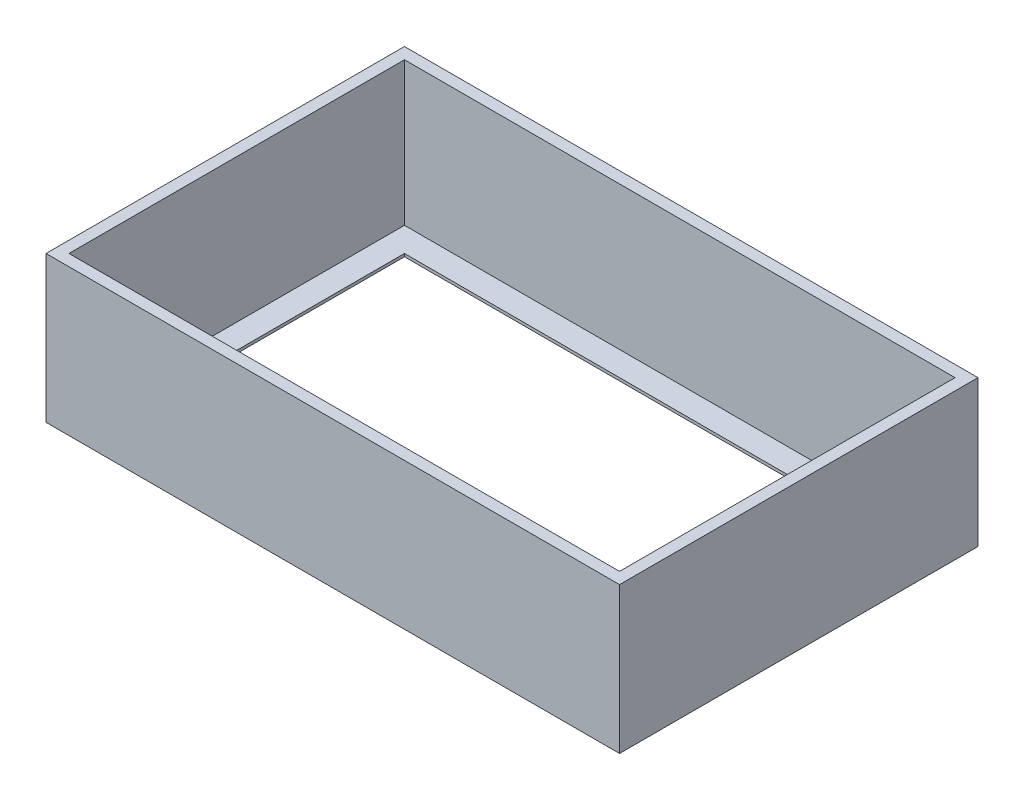
ISO-10303-21;
HEADER;
FILE_DESCRIPTION(('STEP AP214'),'2;1');
FILE_NAME('part.step','',(''),(''),'','','');
FILE_SCHEMA(('AUTOMOTIVE_DESIGN { 1 0 10303 214 1 1 1 1 }'));
ENDSEC;
DATA;
#1=APPLICATION_CONTEXT('core data for automotive mechanical design processes');
#2=APPLICATION_PROTOCOL_DEFINITION('international standard','automotive_design',2000,#1);
#3=PRODUCT_CONTEXT('',#1,'mechanical');
#4=PRODUCT('Part','Part','',(#3));
#5=PRODUCT_RELATED_PRODUCT_CATEGORY('part','',(#4));
#6=PRODUCT_DEFINITION_FORMATION('','',#4);
#7=PRODUCT_DEFINITION_CONTEXT('part definition',#1,'design');
#8=PRODUCT_DEFINITION('design','',#6,#7);
#9=PRODUCT_DEFINITION_SHAPE('','',#8);
#10=(LENGTH_UNIT() NAMED_UNIT(*) SI_UNIT(.MILLI.,.METRE.));
#11=(NAMED_UNIT(*) PLANE_ANGLE_UNIT() SI_UNIT($,.RADIAN.));
#12=(NAMED_UNIT(*) SI_UNIT($,.STERADIAN.) SOLID_ANGLE_UNIT());
#13=UNCERTAINTY_MEASURE_WITH_UNIT(LENGTH_MEASURE(1.E-05),#10,'distance_accuracy_value','');
#14=(GEOMETRIC_REPRESENTATION_CONTEXT(3) GLOBAL_UNCERTAINTY_ASSIGNED_CONTEXT((#13)) GLOBAL_UNIT_ASSIGNED_CONTEXT((#10,
#11,#12)) REPRESENTATION_CONTEXT('',''));
#15=CARTESIAN_POINT('',(0.,0.,0.));
#16=DIRECTION('',(0.,0.,1.));
#17=DIRECTION('',(1.,0.,0.));
#18=AXIS2_PLACEMENT_3D('',#15,#16,#17);
#19=CARTESIAN_POINT('',(0.973770477967721,0.4,0.77550022203393));
#20=DIRECTION('',(1.,0.,0.));
#21=DIRECTION('',(0.,0.,-1.));
#22=AXIS2_PLACEMENT_3D('',#19,#20,#21);
#23=PLANE('',#22);
#24=DIRECTION('',(0.,0.,1.));
#25=VECTOR('',#24,1.);
#26=CARTESIAN_POINT('',(0.973770477967721,0.,0.77550022203393));
#27=LINE('',#26,#25);
#28=CARTESIAN_POINT('',(0.973770477967721,0.,0.77550022203393));
#29=VERTEX_POINT('',#28);
#30=CARTESIAN_POINT('',(0.973770477967721,0.,50.7755002220339));
#31=VERTEX_POINT('',#30);
#32=EDGE_CURVE('E189',#29,#31,#27,.T.);
#33=ORIENTED_EDGE('',*,*,#32,.T.);
#34=DIRECTION('',(0.,-1.,0.));
#35=VECTOR('',#34,1.);
#36=CARTESIAN_POINT('',(0.973770477967721,0.4,50.7755002220339));
#37=LINE('',#36,#35);
#38=CARTESIAN_POINT('',(0.973770477967721,20.4,50.7755002220339));
#39=VERTEX_POINT('',#38);
#40=EDGE_CURVE('E207',#39,#31,#37,.T.);
#41=ORIENTED_EDGE('',*,*,#40,.F.);
#42=DIRECTION('',(0.,0.,1.));
#43=VECTOR('',#42,1.);
#44=CARTESIAN_POINT('',(0.973770477967721,20.4,0.77550022203393));
#45=LINE('',#44,#43);
#46=CARTESIAN_POINT('',(0.973770477967721,20.4,0.77550022203393));
#47=VERTEX_POINT('',#46);
#48=EDGE_CURVE('E177',#47,#39,#45,.T.);
#49=ORIENTED_EDGE('',*,*,#48,.F.);
#50=DIRECTION('',(0.,-1.,0.));
#51=VECTOR('',#50,1.);
#52=CARTESIAN_POINT('',(0.973770477967721,0.4,0.77550022203393));
#53=LINE('',#52,#51);
#54=EDGE_CURVE('E198',#47,#29,#53,.T.);
#55=ORIENTED_EDGE('',*,*,#54,.T.);
#56=EDGE_LOOP('',(#33,#41,#49,#55));
#57=FACE_BOUND('',#56,.T.);
#58=ADVANCED_FACE('F33',(#57),#23,.F.);
#59=CARTESIAN_POINT('',(0.973770477967721,0.4,50.7755002220339));
#60=DIRECTION('',(0.,0.,-1.));
#61=DIRECTION('',(-1.,0.,0.));
#62=AXIS2_PLACEMENT_3D('',#59,#60,#61);
#63=PLANE('',#62);
#64=DIRECTION('',(1.,0.,0.));
#65=VECTOR('',#64,1.);
#66=CARTESIAN_POINT('',(0.973770477967721,0.,50.7755002220339));
#67=LINE('',#66,#65);
#68=CARTESIAN_POINT('',(80.9737704779677,0.,50.7755002220339));
#69=VERTEX_POINT('',#68);
#70=EDGE_CURVE('E192',#31,#69,#67,.T.);
#71=ORIENTED_EDGE('',*,*,#70,.T.);
#72=DIRECTION('',(0.,-1.,0.));
#73=VECTOR('',#72,1.);
#74=CARTESIAN_POINT('',(80.9737704779677,0.4,50.7755002220339));
#75=LINE('',#74,#73);
#76=CARTESIAN_POINT('',(80.9737704779677,20.4,50.7755002220339));
#77=VERTEX_POINT('',#76);
#78=EDGE_CURVE('E204',#77,#69,#75,.T.);
#79=ORIENTED_EDGE('',*,*,#78,.F.);
#80=DIRECTION('',(1.,0.,0.));
#81=VECTOR('',#80,1.);
#82=CARTESIAN_POINT('',(0.973770477967721,20.4,50.7755002220339));
#83=LINE('',#82,#81);
#84=EDGE_CURVE('E180',#39,#77,#83,.T.);
#85=ORIENTED_EDGE('',*,*,#84,.F.);
#86=ORIENTED_EDGE('',*,*,#40,.T.);
#87=EDGE_LOOP('',(#71,#79,#85,#86));
#88=FACE_BOUND('',#87,.T.);
#89=ADVANCED_FACE('F233',(#88),#63,.F.);
#90=CARTESIAN_POINT('',(80.9737704779677,0.4,0.775500222033924));
#91=DIRECTION('',(-1.,0.,0.));
#92=DIRECTION('',(0.,0.,1.));
#93=AXIS2_PLACEMENT_3D('',#90,#91,#92);
#94=PLANE('',#93);
#95=DIRECTION('',(0.,0.,-1.));
#96=VECTOR('',#95,1.);
#97=CARTESIAN_POINT('',(80.9737704779677,0.,0.775500222033924));
#98=LINE('',#97,#96);
#99=CARTESIAN_POINT('',(80.9737704779677,0.,0.775500222033924));
#100=VERTEX_POINT('',#99);
#101=EDGE_CURVE('E194',#69,#100,#98,.T.);
#102=ORIENTED_EDGE('',*,*,#101,.T.);
#103=DIRECTION('',(0.,-1.,0.));
#104=VECTOR('',#103,1.);
#105=CARTESIAN_POINT('',(80.9737704779677,0.4,0.775500222033924));
#106=LINE('',#105,#104);
#107=CARTESIAN_POINT('',(80.9737704779677,20.4,0.77550022203393));
#108=VERTEX_POINT('',#107);
#109=EDGE_CURVE('E201',#108,#100,#106,.T.);
#110=ORIENTED_EDGE('',*,*,#109,.F.);
#111=DIRECTION('',(0.,0.,-1.));
#112=VECTOR('',#111,1.);
#113=CARTESIAN_POINT('',(80.9737704779677,20.4,0.77550022203393));
#114=LINE('',#113,#112);
#115=EDGE_CURVE('E183',#77,#108,#114,.T.);
#116=ORIENTED_EDGE('',*,*,#115,.F.);
#117=ORIENTED_EDGE('',*,*,#78,.T.);
#118=EDGE_LOOP('',(#102,#110,#116,#117));
#119=FACE_BOUND('',#118,.T.);
#120=ADVANCED_FACE('F238',(#119),#94,.F.);
#121=CARTESIAN_POINT('',(0.973770477967721,0.4,0.77550022203393));
#122=DIRECTION('',(0.,0.,1.));
#123=DIRECTION('',(1.,0.,0.));
#124=AXIS2_PLACEMENT_3D('',#121,#122,#123);
#125=PLANE('',#124);
#126=DIRECTION('',(-1.,0.,0.));
#127=VECTOR('',#126,1.);
#128=CARTESIAN_POINT('',(0.973770477967721,0.,0.77550022203393));
#129=LINE('',#128,#127);
#130=EDGE_CURVE('E196',#100,#29,#129,.T.);
#131=ORIENTED_EDGE('',*,*,#130,.T.);
#132=ORIENTED_EDGE('',*,*,#54,.F.);
#133=DIRECTION('',(-1.,0.,0.));
#134=VECTOR('',#133,1.);
#135=CARTESIAN_POINT('',(0.973770477967721,20.4,0.77550022203393));
#136=LINE('',#135,#134);
#137=EDGE_CURVE('E186',#108,#47,#136,.T.);
#138=ORIENTED_EDGE('',*,*,#137,.F.);
#139=ORIENTED_EDGE('',*,*,#109,.T.);
#140=EDGE_LOOP('',(#131,#132,#138,#139));
#141=FACE_BOUND('',#140,.T.);
#142=ADVANCED_FACE('F251',(#141),#125,.F.);
#143=CARTESIAN_POINT('',(0.,0.,0.));
#144=DIRECTION('',(0.,1.,0.));
#145=DIRECTION('',(0.,0.,1.));
#146=AXIS2_PLACEMENT_3D('',#143,#144,#145);
#147=PLANE('',#146);
#148=DIRECTION('',(0.,0.,1.));
#149=VECTOR('',#148,1.);
#150=CARTESIAN_POINT('',(75.9737704779677,0.,5.77550022203393));
#151=LINE('',#150,#149);
#152=CARTESIAN_POINT('',(75.9737704779677,0.,5.77550022203393));
#153=VERTEX_POINT('',#152);
#154=CARTESIAN_POINT('',(75.9737704779677,0.,45.7755002220339));
#155=VERTEX_POINT('',#154);
#156=EDGE_CURVE('E132',#153,#155,#151,.T.);
#157=ORIENTED_EDGE('',*,*,#156,.F.);
#158=DIRECTION('',(1.,0.,0.));
#159=VECTOR('',#158,1.);
#160=CARTESIAN_POINT('',(5.97377047796772,0.,5.77550022203392));
#161=LINE('',#160,#159);
#162=CARTESIAN_POINT('',(5.97377047796772,0.,5.77550022203392));
#163=VERTEX_POINT('',#162);
#164=EDGE_CURVE('E47',#163,#153,#161,.T.);
#165=ORIENTED_EDGE('',*,*,#164,.F.);
#166=DIRECTION('',(0.,0.,-1.));
#167=VECTOR('',#166,1.);
#168=CARTESIAN_POINT('',(5.97377047796772,0.,5.77550022203392));
#169=LINE('',#168,#167);
#170=CARTESIAN_POINT('',(5.97377047796772,0.,45.7755002220339));
#171=VERTEX_POINT('',#170);
#172=EDGE_CURVE('E139',#171,#163,#169,.T.);
#173=ORIENTED_EDGE('',*,*,#172,.F.);
#174=DIRECTION('',(-1.,0.,0.));
#175=VECTOR('',#174,1.);
#176=CARTESIAN_POINT('',(5.97377047796772,0.,45.7755002220339));
#177=LINE('',#176,#175);
#178=EDGE_CURVE('E123',#155,#171,#177,.T.);
#179=ORIENTED_EDGE('',*,*,#178,.F.);
#180=EDGE_LOOP('',(#157,#165,#173,#179));
#181=FACE_BOUND('',#180,.T.);
#182=ORIENTED_EDGE('',*,*,#32,.F.);
#183=ORIENTED_EDGE('',*,*,#130,.F.);
#184=ORIENTED_EDGE('',*,*,#101,.F.);
#185=ORIENTED_EDGE('',*,*,#70,.F.);
#186=EDGE_LOOP('',(#182,#183,#184,#185));
#187=FACE_BOUND('',#186,.T.);
#188=ADVANCED_FACE('F136',(#181,#187),#147,.F.);
#189=CARTESIAN_POINT('',(0.,20.4,0.));
#190=DIRECTION('',(0.,1.,0.));
#191=DIRECTION('',(0.,0.,1.));
#192=AXIS2_PLACEMENT_3D('',#189,#190,#191);
#193=PLANE('',#192);
#194=ORIENTED_EDGE('',*,*,#48,.T.);
#195=ORIENTED_EDGE('',*,*,#84,.T.);
#196=ORIENTED_EDGE('',*,*,#115,.T.);
#197=ORIENTED_EDGE('',*,*,#137,.T.);
#198=EDGE_LOOP('',(#194,#195,#196,#197));
#199=FACE_BOUND('',#198,.T.);
#200=DIRECTION('',(0.,0.,1.));
#201=VECTOR('',#200,1.);
#202=CARTESIAN_POINT('',(2.57377047796772,20.4,2.37550022203393));
#203=LINE('',#202,#201);
#204=CARTESIAN_POINT('',(2.57377047796772,20.4,2.37550022203393));
#205=VERTEX_POINT('',#204);
#206=CARTESIAN_POINT('',(2.57377047796773,20.4,49.1755002220339));
#207=VERTEX_POINT('',#206);
#208=EDGE_CURVE('E151',#205,#207,#203,.T.);
#209=ORIENTED_EDGE('',*,*,#208,.F.);
#210=DIRECTION('',(-1.,0.,0.));
#211=VECTOR('',#210,1.);
#212=CARTESIAN_POINT('',(2.57377047796772,20.4,2.37550022203393));
#213=LINE('',#212,#211);
#214=CARTESIAN_POINT('',(79.3737704779677,20.4,2.37550022203393));
#215=VERTEX_POINT('',#214);
#216=EDGE_CURVE('E149',#215,#205,#213,.T.);
#217=ORIENTED_EDGE('',*,*,#216,.F.);
#218=DIRECTION('',(0.,0.,-1.));
#219=VECTOR('',#218,1.);
#220=CARTESIAN_POINT('',(79.3737704779677,20.4,2.37550022203393));
#221=LINE('',#220,#219);
#222=CARTESIAN_POINT('',(79.3737704779677,20.4,49.1755002220339));
#223=VERTEX_POINT('',#222);
#224=EDGE_CURVE('E157',#223,#215,#221,.T.);
#225=ORIENTED_EDGE('',*,*,#224,.F.);
#226=DIRECTION('',(1.,0.,0.));
#227=VECTOR('',#226,1.);
#228=CARTESIAN_POINT('',(2.57377047796773,20.4,49.1755002220339));
#229=LINE('',#228,#227);
#230=EDGE_CURVE('E154',#207,#223,#229,.T.);
#231=ORIENTED_EDGE('',*,*,#230,.F.);
#232=EDGE_LOOP('',(#209,#217,#225,#231));
#233=FACE_BOUND('',#232,.T.);
#234=ADVANCED_FACE('F247',(#199,#233),#193,.T.);
#235=CARTESIAN_POINT('',(2.57377047796772,20.4,2.37550022203393));
#236=DIRECTION('',(0.,0.,1.));
#237=DIRECTION('',(1.,0.,0.));
#238=AXIS2_PLACEMENT_3D('',#235,#236,#237);
#239=PLANE('',#238);
#240=DIRECTION('',(-1.,0.,0.));
#241=VECTOR('',#240,1.);
#242=CARTESIAN_POINT('',(2.57377047796772,0.4,2.37550022203393));
#243=LINE('',#242,#241);
#244=CARTESIAN_POINT('',(79.3737704779677,0.4,2.37550022203393));
#245=VERTEX_POINT('',#244);
#246=CARTESIAN_POINT('',(2.57377047796772,0.4,2.37550022203393));
#247=VERTEX_POINT('',#246);
#248=EDGE_CURVE('E146',#245,#247,#243,.T.);
#249=ORIENTED_EDGE('',*,*,#248,.F.);
#250=DIRECTION('',(0.,-1.,0.));
#251=VECTOR('',#250,1.);
#252=CARTESIAN_POINT('',(79.3737704779677,20.4,2.37550022203393));
#253=LINE('',#252,#251);
#254=EDGE_CURVE('E159',#215,#245,#253,.T.);
#255=ORIENTED_EDGE('',*,*,#254,.F.);
#256=ORIENTED_EDGE('',*,*,#216,.T.);
#257=DIRECTION('',(0.,-1.,0.));
#258=VECTOR('',#257,1.);
#259=CARTESIAN_POINT('',(2.57377047796772,20.4,2.37550022203393));
#260=LINE('',#259,#258);
#261=EDGE_CURVE('E174',#205,#247,#260,.T.);
#262=ORIENTED_EDGE('',*,*,#261,.T.);
#263=EDGE_LOOP('',(#249,#255,#256,#262));
#264=FACE_BOUND('',#263,.T.);
#265=ADVANCED_FACE('F264',(#264),#239,.T.);
#266=CARTESIAN_POINT('',(2.57377047796772,20.4,2.37550022203393));
#267=DIRECTION('',(1.,0.,0.));
#268=DIRECTION('',(0.,0.,-1.));
#269=AXIS2_PLACEMENT_3D('',#266,#267,#268);
#270=PLANE('',#269);
#271=DIRECTION('',(0.,0.,1.));
#272=VECTOR('',#271,1.);
#273=CARTESIAN_POINT('',(2.57377047796772,0.4,2.37550022203393));
#274=LINE('',#273,#272);
#275=CARTESIAN_POINT('',(2.57377047796773,0.4,49.1755002220339));
#276=VERTEX_POINT('',#275);
#277=EDGE_CURVE('E161',#247,#276,#274,.T.);
#278=ORIENTED_EDGE('',*,*,#277,.F.);
#279=ORIENTED_EDGE('',*,*,#261,.F.);
#280=ORIENTED_EDGE('',*,*,#208,.T.);
#281=DIRECTION('',(0.,-1.,0.));
#282=VECTOR('',#281,1.);
#283=CARTESIAN_POINT('',(2.57377047796773,20.4,49.1755002220339));
#284=LINE('',#283,#282);
#285=EDGE_CURVE('E171',#207,#276,#284,.T.);
#286=ORIENTED_EDGE('',*,*,#285,.T.);
#287=EDGE_LOOP('',(#278,#279,#280,#286));
#288=FACE_BOUND('',#287,.T.);
#289=ADVANCED_FACE('F267',(#288),#270,.T.);
#290=CARTESIAN_POINT('',(2.57377047796773,20.4,49.1755002220339));
#291=DIRECTION('',(0.,0.,-1.));
#292=DIRECTION('',(-1.,0.,0.));
#293=AXIS2_PLACEMENT_3D('',#290,#291,#292);
#294=PLANE('',#293);
#295=DIRECTION('',(1.,0.,0.));
#296=VECTOR('',#295,1.);
#297=CARTESIAN_POINT('',(2.57377047796773,0.4,49.1755002220339));
#298=LINE('',#297,#296);
#299=CARTESIAN_POINT('',(79.3737704779677,0.4,49.1755002220339));
#300=VERTEX_POINT('',#299);
#301=EDGE_CURVE('E163',#276,#300,#298,.T.);
#302=ORIENTED_EDGE('',*,*,#301,.F.);
#303=ORIENTED_EDGE('',*,*,#285,.F.);
#304=ORIENTED_EDGE('',*,*,#230,.T.);
#305=DIRECTION('',(0.,-1.,0.));
#306=VECTOR('',#305,1.);
#307=CARTESIAN_POINT('',(79.3737704779677,20.4,49.1755002220339));
#308=LINE('',#307,#306);
#309=EDGE_CURVE('E168',#223,#300,#308,.T.);
#310=ORIENTED_EDGE('',*,*,#309,.T.);
#311=EDGE_LOOP('',(#302,#303,#304,#310));
#312=FACE_BOUND('',#311,.T.);
#313=ADVANCED_FACE('F271',(#312),#294,.T.);
#314=CARTESIAN_POINT('',(79.3737704779677,20.4,2.37550022203393));
#315=DIRECTION('',(-1.,0.,0.));
#316=DIRECTION('',(0.,0.,1.));
#317=AXIS2_PLACEMENT_3D('',#314,#315,#316);
#318=PLANE('',#317);
#319=DIRECTION('',(0.,0.,-1.));
#320=VECTOR('',#319,1.);
#321=CARTESIAN_POINT('',(79.3737704779677,0.4,2.37550022203393));
#322=LINE('',#321,#320);
#323=EDGE_CURVE('E152',#300,#245,#322,.T.);
#324=ORIENTED_EDGE('',*,*,#323,.F.);
#325=ORIENTED_EDGE('',*,*,#309,.F.);
#326=ORIENTED_EDGE('',*,*,#224,.T.);
#327=ORIENTED_EDGE('',*,*,#254,.T.);
#328=EDGE_LOOP('',(#324,#325,#326,#327));
#329=FACE_BOUND('',#328,.T.);
#330=ADVANCED_FACE('F228',(#329),#318,.T.);
#331=CARTESIAN_POINT('',(0.,0.4,0.));
#332=DIRECTION('',(0.,1.,0.));
#333=DIRECTION('',(0.,0.,1.));
#334=AXIS2_PLACEMENT_3D('',#331,#332,#333);
#335=PLANE('',#334);
#336=DIRECTION('',(-1.,0.,0.));
#337=VECTOR('',#336,1.);
#338=CARTESIAN_POINT('',(0.,0.4,5.77550022203392));
#339=LINE('',#338,#337);
#340=CARTESIAN_POINT('',(75.9737704779677,0.400000000000001,5.77550022203393));
#341=VERTEX_POINT('',#340);
#342=CARTESIAN_POINT('',(5.97377047796772,0.400000000000001,5.77550022203392));
#343=VERTEX_POINT('',#342);
#344=EDGE_CURVE('E11',#341,#343,#339,.T.);
#345=ORIENTED_EDGE('',*,*,#344,.F.);
#346=DIRECTION('',(0.,0.,-1.));
#347=VECTOR('',#346,1.);
#348=CARTESIAN_POINT('',(75.9737704779677,0.4,0.));
#349=LINE('',#348,#347);
#350=CARTESIAN_POINT('',(75.9737704779677,0.4,45.7755002220339));
#351=VERTEX_POINT('',#350);
#352=EDGE_CURVE('E210',#351,#341,#349,.T.);
#353=ORIENTED_EDGE('',*,*,#352,.F.);
#354=DIRECTION('',(1.,0.,0.));
#355=VECTOR('',#354,1.);
#356=CARTESIAN_POINT('',(0.,0.4,45.7755002220339));
#357=LINE('',#356,#355);
#358=CARTESIAN_POINT('',(5.97377047796772,0.400000000000001,45.7755002220339));
#359=VERTEX_POINT('',#358);
#360=EDGE_CURVE('E126',#359,#351,#357,.T.);
#361=ORIENTED_EDGE('',*,*,#360,.F.);
#362=DIRECTION('',(0.,0.,1.));
#363=VECTOR('',#362,1.);
#364=CARTESIAN_POINT('',(5.97377047796772,0.4,0.));
#365=LINE('',#364,#363);
#366=EDGE_CURVE('E40',#343,#359,#365,.T.);
#367=ORIENTED_EDGE('',*,*,#366,.F.);
#368=EDGE_LOOP('',(#345,#353,#361,#367));
#369=FACE_BOUND('',#368,.T.);
#370=ORIENTED_EDGE('',*,*,#248,.T.);
#371=ORIENTED_EDGE('',*,*,#277,.T.);
#372=ORIENTED_EDGE('',*,*,#301,.T.);
#373=ORIENTED_EDGE('',*,*,#323,.T.);
#374=EDGE_LOOP('',(#370,#371,#372,#373));
#375=FACE_BOUND('',#374,.T.);
#376=ADVANCED_FACE('F218',(#369,#375),#335,.T.);
#377=CARTESIAN_POINT('',(5.97377047796772,20.4,5.77550022203392));
#378=DIRECTION('',(0.,0.,-1.));
#379=DIRECTION('',(-1.,0.,0.));
#380=AXIS2_PLACEMENT_3D('',#377,#378,#379);
#381=PLANE('',#380);
#382=ORIENTED_EDGE('',*,*,#344,.T.);
#383=DIRECTION('',(0.,-1.,0.));
#384=VECTOR('',#383,1.);
#385=CARTESIAN_POINT('',(5.97377047796772,20.4,5.77550022203392));
#386=LINE('',#385,#384);
#387=EDGE_CURVE('E144',#343,#163,#386,.T.);
#388=ORIENTED_EDGE('',*,*,#387,.T.);
#389=ORIENTED_EDGE('',*,*,#164,.T.);
#390=DIRECTION('',(0.,-1.,0.));
#391=VECTOR('',#390,1.);
#392=CARTESIAN_POINT('',(75.9737704779677,20.4,5.77550022203393));
#393=LINE('',#392,#391);
#394=EDGE_CURVE('E129',#341,#153,#393,.T.);
#395=ORIENTED_EDGE('',*,*,#394,.F.);
#396=EDGE_LOOP('',(#382,#388,#389,#395));
#397=FACE_BOUND('',#396,.T.);
#398=ADVANCED_FACE('F220',(#397),#381,.F.);
#399=CARTESIAN_POINT('',(5.97377047796772,20.4,5.77550022203392));
#400=DIRECTION('',(-1.,0.,0.));
#401=DIRECTION('',(0.,0.,1.));
#402=AXIS2_PLACEMENT_3D('',#399,#400,#401);
#403=PLANE('',#402);
#404=ORIENTED_EDGE('',*,*,#366,.T.);
#405=DIRECTION('',(0.,-1.,0.));
#406=VECTOR('',#405,1.);
#407=CARTESIAN_POINT('',(5.97377047796772,20.4,45.7755002220339));
#408=LINE('',#407,#406);
#409=EDGE_CURVE('E128',#359,#171,#408,.T.);
#410=ORIENTED_EDGE('',*,*,#409,.T.);
#411=ORIENTED_EDGE('',*,*,#172,.T.);
#412=ORIENTED_EDGE('',*,*,#387,.F.);
#413=EDGE_LOOP('',(#404,#410,#411,#412));
#414=FACE_BOUND('',#413,.T.);
#415=ADVANCED_FACE('F215',(#414),#403,.F.);
#416=CARTESIAN_POINT('',(5.97377047796772,20.4,45.7755002220339));
#417=DIRECTION('',(0.,0.,1.));
#418=DIRECTION('',(1.,0.,0.));
#419=AXIS2_PLACEMENT_3D('',#416,#417,#418);
#420=PLANE('',#419);
#421=ORIENTED_EDGE('',*,*,#360,.T.);
#422=DIRECTION('',(0.,-1.,0.));
#423=VECTOR('',#422,1.);
#424=CARTESIAN_POINT('',(75.9737704779677,20.4,45.7755002220339));
#425=LINE('',#424,#423);
#426=EDGE_CURVE('E55',#351,#155,#425,.T.);
#427=ORIENTED_EDGE('',*,*,#426,.T.);
#428=ORIENTED_EDGE('',*,*,#178,.T.);
#429=ORIENTED_EDGE('',*,*,#409,.F.);
#430=EDGE_LOOP('',(#421,#427,#428,#429));
#431=FACE_BOUND('',#430,.T.);
#432=ADVANCED_FACE('F120',(#431),#420,.F.);
#433=CARTESIAN_POINT('',(75.9737704779677,20.4,5.77550022203393));
#434=DIRECTION('',(1.,0.,0.));
#435=DIRECTION('',(0.,0.,-1.));
#436=AXIS2_PLACEMENT_3D('',#433,#434,#435);
#437=PLANE('',#436);
#438=ORIENTED_EDGE('',*,*,#352,.T.);
#439=ORIENTED_EDGE('',*,*,#394,.T.);
#440=ORIENTED_EDGE('',*,*,#156,.T.);
#441=ORIENTED_EDGE('',*,*,#426,.F.);
#442=EDGE_LOOP('',(#438,#439,#440,#441));
#443=FACE_BOUND('',#442,.T.);
#444=ADVANCED_FACE('F133',(#443),#437,.F.);
#445=CLOSED_SHELL('',(#58,#89,#120,#142,#188,#234,#265,#289,#313,#330,#376,#398,#415,#432,#444));
#446=MANIFOLD_SOLID_BREP('B2',#445);
#447=ADVANCED_BREP_SHAPE_REPRESENTATION('',(#18,#446),#14);
#448=SHAPE_DEFINITION_REPRESENTATION(#9,#447);
ENDSEC;
END-ISO-10303-21;
